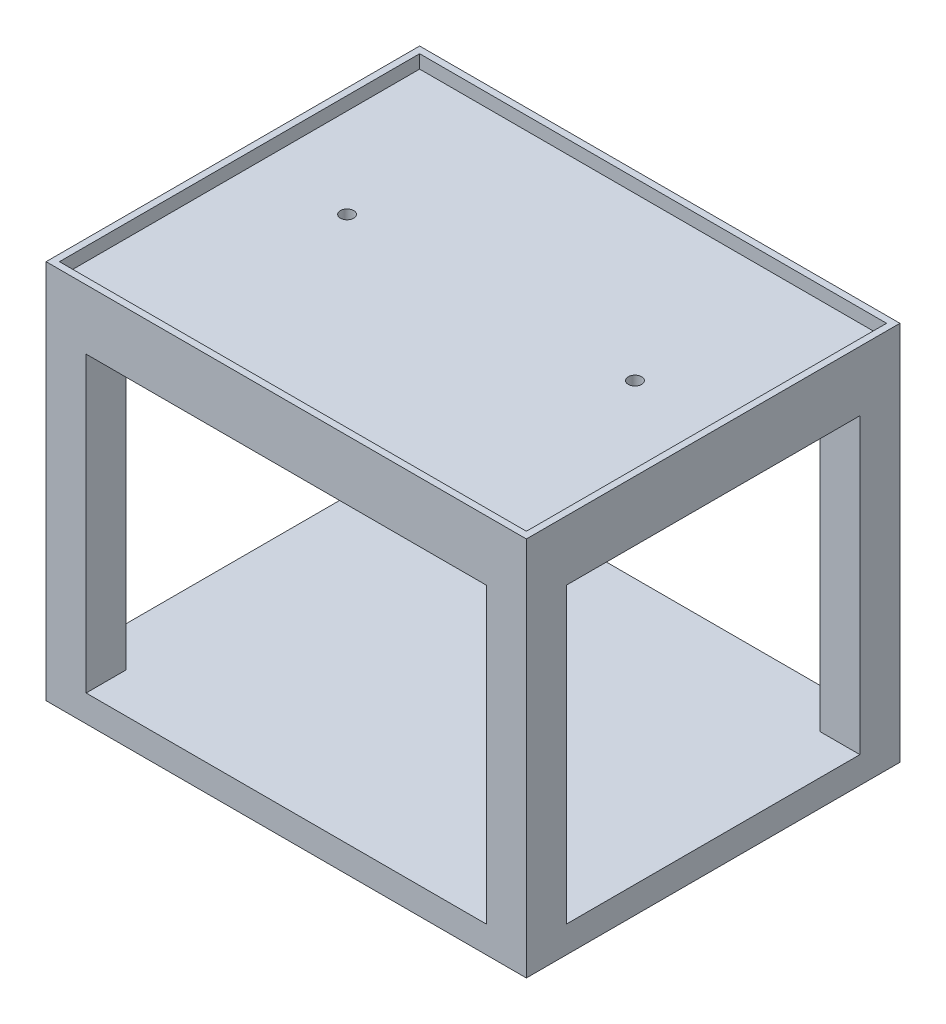
ISO-10303-21;
HEADER;
FILE_DESCRIPTION(('STEP AP214'),'2;1');
FILE_NAME('part.step','',(''),(''),'','','');
FILE_SCHEMA(('AUTOMOTIVE_DESIGN { 1 0 10303 214 1 1 1 1 }'));
ENDSEC;
DATA;
#1=APPLICATION_CONTEXT('core data for automotive mechanical design processes');
#2=APPLICATION_PROTOCOL_DEFINITION('international standard','automotive_design',2000,#1);
#3=PRODUCT_CONTEXT('',#1,'mechanical');
#4=PRODUCT('Part','Part','',(#3));
#5=PRODUCT_RELATED_PRODUCT_CATEGORY('part','',(#4));
#6=PRODUCT_DEFINITION_FORMATION('','',#4);
#7=PRODUCT_DEFINITION_CONTEXT('part definition',#1,'design');
#8=PRODUCT_DEFINITION('design','',#6,#7);
#9=PRODUCT_DEFINITION_SHAPE('','',#8);
#10=(LENGTH_UNIT() NAMED_UNIT(*) SI_UNIT(.MILLI.,.METRE.));
#11=(NAMED_UNIT(*) PLANE_ANGLE_UNIT() SI_UNIT($,.RADIAN.));
#12=(NAMED_UNIT(*) SI_UNIT($,.STERADIAN.) SOLID_ANGLE_UNIT());
#13=UNCERTAINTY_MEASURE_WITH_UNIT(LENGTH_MEASURE(1.E-05),#10,'distance_accuracy_value','');
#14=(GEOMETRIC_REPRESENTATION_CONTEXT(3) GLOBAL_UNCERTAINTY_ASSIGNED_CONTEXT((#13)) GLOBAL_UNIT_ASSIGNED_CONTEXT((#10,
#11,#12)) REPRESENTATION_CONTEXT('',''));
#15=CARTESIAN_POINT('',(0.,0.,0.));
#16=DIRECTION('',(0.,0.,1.));
#17=DIRECTION('',(1.,0.,0.));
#18=AXIS2_PLACEMENT_3D('',#15,#16,#17);
#19=CARTESIAN_POINT('',(-457.2,-609.6,279.4));
#20=DIRECTION('',(0.,0.,1.));
#21=DIRECTION('',(1.,0.,0.));
#22=AXIS2_PLACEMENT_3D('',#19,#20,#21);
#23=PLANE('',#22);
#24=DIRECTION('',(1.,0.,0.));
#25=VECTOR('',#24,1.);
#26=CARTESIAN_POINT('',(-457.2,-558.8,279.4));
#27=LINE('',#26,#25);
#28=CARTESIAN_POINT('',(-457.2,-558.8,279.4));
#29=VERTEX_POINT('',#28);
#30=CARTESIAN_POINT('',(-381.,-558.8,279.4));
#31=VERTEX_POINT('',#30);
#32=EDGE_CURVE('E615',#29,#31,#27,.T.);
#33=ORIENTED_EDGE('',*,*,#32,.F.);
#34=DIRECTION('',(0.,1.,0.));
#35=VECTOR('',#34,1.);
#36=CARTESIAN_POINT('',(-457.2,-609.6,279.4));
#37=LINE('',#36,#35);
#38=CARTESIAN_POINT('',(-457.2,0.,279.4));
#39=VERTEX_POINT('',#38);
#40=EDGE_CURVE('E272',#29,#39,#37,.T.);
#41=ORIENTED_EDGE('',*,*,#40,.T.);
#42=DIRECTION('',(1.,0.,0.));
#43=VECTOR('',#42,1.);
#44=CARTESIAN_POINT('',(-457.2,0.,279.4));
#45=LINE('',#44,#43);
#46=CARTESIAN_POINT('',(-381.,0.,279.4));
#47=VERTEX_POINT('',#46);
#48=EDGE_CURVE('E250',#39,#47,#45,.T.);
#49=ORIENTED_EDGE('',*,*,#48,.T.);
#50=DIRECTION('',(0.,1.,0.));
#51=VECTOR('',#50,1.);
#52=CARTESIAN_POINT('',(-381.,-609.6,279.4));
#53=LINE('',#52,#51);
#54=EDGE_CURVE('E269',#31,#47,#53,.T.);
#55=ORIENTED_EDGE('',*,*,#54,.F.);
#56=EDGE_LOOP('',(#33,#41,#49,#55));
#57=FACE_BOUND('',#56,.T.);
#58=ADVANCED_FACE('F40',(#57),#23,.F.);
#59=CARTESIAN_POINT('',(-381.,-609.6,355.6));
#60=DIRECTION('',(-1.,0.,0.));
#61=DIRECTION('',(0.,0.,1.));
#62=AXIS2_PLACEMENT_3D('',#59,#60,#61);
#63=PLANE('',#62);
#64=DIRECTION('',(0.,0.,1.));
#65=VECTOR('',#64,1.);
#66=CARTESIAN_POINT('',(-381.,-558.8,355.6));
#67=LINE('',#66,#65);
#68=CARTESIAN_POINT('',(-381.,-558.8,355.6));
#69=VERTEX_POINT('',#68);
#70=EDGE_CURVE('E603',#31,#69,#67,.T.);
#71=ORIENTED_EDGE('',*,*,#70,.F.);
#72=ORIENTED_EDGE('',*,*,#54,.T.);
#73=DIRECTION('',(0.,0.,1.));
#74=VECTOR('',#73,1.);
#75=CARTESIAN_POINT('',(-381.,0.,355.6));
#76=LINE('',#75,#74);
#77=CARTESIAN_POINT('',(-381.,0.,355.6));
#78=VERTEX_POINT('',#77);
#79=EDGE_CURVE('E256',#47,#78,#76,.T.);
#80=ORIENTED_EDGE('',*,*,#79,.T.);
#81=DIRECTION('',(0.,1.,0.));
#82=VECTOR('',#81,1.);
#83=CARTESIAN_POINT('',(-381.,-609.6,355.6));
#84=LINE('',#83,#82);
#85=EDGE_CURVE('E260',#69,#78,#84,.T.);
#86=ORIENTED_EDGE('',*,*,#85,.F.);
#87=EDGE_LOOP('',(#71,#72,#80,#86));
#88=FACE_BOUND('',#87,.T.);
#89=ADVANCED_FACE('F385',(#88),#63,.F.);
#90=CARTESIAN_POINT('',(381.,-609.6,355.6));
#91=DIRECTION('',(1.,0.,0.));
#92=DIRECTION('',(0.,0.,-1.));
#93=AXIS2_PLACEMENT_3D('',#90,#91,#92);
#94=PLANE('',#93);
#95=DIRECTION('',(0.,0.,-1.));
#96=VECTOR('',#95,1.);
#97=CARTESIAN_POINT('',(381.,-558.8,355.6));
#98=LINE('',#97,#96);
#99=CARTESIAN_POINT('',(381.,-558.8,355.6));
#100=VERTEX_POINT('',#99);
#101=CARTESIAN_POINT('',(381.,-558.8,279.4));
#102=VERTEX_POINT('',#101);
#103=EDGE_CURVE('E598',#100,#102,#98,.T.);
#104=ORIENTED_EDGE('',*,*,#103,.F.);
#105=DIRECTION('',(0.,1.,0.));
#106=VECTOR('',#105,1.);
#107=CARTESIAN_POINT('',(381.,-609.6,355.6));
#108=LINE('',#107,#106);
#109=CARTESIAN_POINT('',(381.,0.,355.6));
#110=VERTEX_POINT('',#109);
#111=EDGE_CURVE('E247',#100,#110,#108,.T.);
#112=ORIENTED_EDGE('',*,*,#111,.T.);
#113=DIRECTION('',(0.,0.,-1.));
#114=VECTOR('',#113,1.);
#115=CARTESIAN_POINT('',(381.,0.,355.6));
#116=LINE('',#115,#114);
#117=CARTESIAN_POINT('',(381.,0.,279.4));
#118=VERTEX_POINT('',#117);
#119=EDGE_CURVE('E231',#110,#118,#116,.T.);
#120=ORIENTED_EDGE('',*,*,#119,.T.);
#121=DIRECTION('',(0.,1.,0.));
#122=VECTOR('',#121,1.);
#123=CARTESIAN_POINT('',(381.,-609.6,279.4));
#124=LINE('',#123,#122);
#125=EDGE_CURVE('E244',#102,#118,#124,.T.);
#126=ORIENTED_EDGE('',*,*,#125,.F.);
#127=EDGE_LOOP('',(#104,#112,#120,#126));
#128=FACE_BOUND('',#127,.T.);
#129=ADVANCED_FACE('F391',(#128),#94,.F.);
#130=CARTESIAN_POINT('',(457.2,-609.6,279.4));
#131=DIRECTION('',(0.,0.,1.));
#132=DIRECTION('',(1.,0.,0.));
#133=AXIS2_PLACEMENT_3D('',#130,#131,#132);
#134=PLANE('',#133);
#135=DIRECTION('',(1.,0.,0.));
#136=VECTOR('',#135,1.);
#137=CARTESIAN_POINT('',(457.2,-558.8,279.4));
#138=LINE('',#137,#136);
#139=CARTESIAN_POINT('',(457.2,-558.8,279.4));
#140=VERTEX_POINT('',#139);
#141=EDGE_CURVE('E604',#102,#140,#138,.T.);
#142=ORIENTED_EDGE('',*,*,#141,.F.);
#143=ORIENTED_EDGE('',*,*,#125,.T.);
#144=DIRECTION('',(1.,0.,0.));
#145=VECTOR('',#144,1.);
#146=CARTESIAN_POINT('',(457.2,0.,279.4));
#147=LINE('',#146,#145);
#148=CARTESIAN_POINT('',(457.2,0.,279.4));
#149=VERTEX_POINT('',#148);
#150=EDGE_CURVE('E236',#118,#149,#147,.T.);
#151=ORIENTED_EDGE('',*,*,#150,.T.);
#152=DIRECTION('',(0.,1.,0.));
#153=VECTOR('',#152,1.);
#154=CARTESIAN_POINT('',(457.2,-609.6,279.4));
#155=LINE('',#154,#153);
#156=EDGE_CURVE('E64',#140,#149,#155,.T.);
#157=ORIENTED_EDGE('',*,*,#156,.F.);
#158=EDGE_LOOP('',(#142,#143,#151,#157));
#159=FACE_BOUND('',#158,.T.);
#160=ADVANCED_FACE('F556',(#159),#134,.F.);
#161=CARTESIAN_POINT('',(457.2,-609.6,-279.4));
#162=DIRECTION('',(0.,0.,-1.));
#163=DIRECTION('',(-1.,0.,0.));
#164=AXIS2_PLACEMENT_3D('',#161,#162,#163);
#165=PLANE('',#164);
#166=DIRECTION('',(-1.,0.,0.));
#167=VECTOR('',#166,1.);
#168=CARTESIAN_POINT('',(457.2,-558.8,-279.4));
#169=LINE('',#168,#167);
#170=CARTESIAN_POINT('',(457.2,-558.8,-279.4));
#171=VERTEX_POINT('',#170);
#172=CARTESIAN_POINT('',(381.,-558.8,-279.4));
#173=VERTEX_POINT('',#172);
#174=EDGE_CURVE('E636',#171,#173,#169,.T.);
#175=ORIENTED_EDGE('',*,*,#174,.F.);
#176=DIRECTION('',(0.,1.,0.));
#177=VECTOR('',#176,1.);
#178=CARTESIAN_POINT('',(457.2,-609.6,-279.4));
#179=LINE('',#178,#177);
#180=CARTESIAN_POINT('',(457.2,0.,-279.4));
#181=VERTEX_POINT('',#180);
#182=EDGE_CURVE('E228',#171,#181,#179,.T.);
#183=ORIENTED_EDGE('',*,*,#182,.T.);
#184=DIRECTION('',(-1.,0.,0.));
#185=VECTOR('',#184,1.);
#186=CARTESIAN_POINT('',(457.2,0.,-279.4));
#187=LINE('',#186,#185);
#188=CARTESIAN_POINT('',(381.,0.,-279.4));
#189=VERTEX_POINT('',#188);
#190=EDGE_CURVE('E206',#181,#189,#187,.T.);
#191=ORIENTED_EDGE('',*,*,#190,.T.);
#192=DIRECTION('',(0.,1.,0.));
#193=VECTOR('',#192,1.);
#194=CARTESIAN_POINT('',(381.,-609.6,-279.4));
#195=LINE('',#194,#193);
#196=EDGE_CURVE('E225',#173,#189,#195,.T.);
#197=ORIENTED_EDGE('',*,*,#196,.F.);
#198=EDGE_LOOP('',(#175,#183,#191,#197));
#199=FACE_BOUND('',#198,.T.);
#200=ADVANCED_FACE('F546',(#199),#165,.F.);
#201=CARTESIAN_POINT('',(381.,-609.6,-355.6));
#202=DIRECTION('',(1.,0.,0.));
#203=DIRECTION('',(0.,0.,-1.));
#204=AXIS2_PLACEMENT_3D('',#201,#202,#203);
#205=PLANE('',#204);
#206=DIRECTION('',(0.,0.,-1.));
#207=VECTOR('',#206,1.);
#208=CARTESIAN_POINT('',(381.,-558.8,-355.6));
#209=LINE('',#208,#207);
#210=CARTESIAN_POINT('',(381.,-558.8,-355.6));
#211=VERTEX_POINT('',#210);
#212=EDGE_CURVE('E185',#173,#211,#209,.T.);
#213=ORIENTED_EDGE('',*,*,#212,.F.);
#214=ORIENTED_EDGE('',*,*,#196,.T.);
#215=DIRECTION('',(0.,0.,-1.));
#216=VECTOR('',#215,1.);
#217=CARTESIAN_POINT('',(381.,0.,-355.6));
#218=LINE('',#217,#216);
#219=CARTESIAN_POINT('',(381.,0.,-355.6));
#220=VERTEX_POINT('',#219);
#221=EDGE_CURVE('E211',#189,#220,#218,.T.);
#222=ORIENTED_EDGE('',*,*,#221,.T.);
#223=DIRECTION('',(0.,1.,0.));
#224=VECTOR('',#223,1.);
#225=CARTESIAN_POINT('',(381.,-609.6,-355.6));
#226=LINE('',#225,#224);
#227=EDGE_CURVE('E56',#211,#220,#226,.T.);
#228=ORIENTED_EDGE('',*,*,#227,.F.);
#229=EDGE_LOOP('',(#213,#214,#222,#228));
#230=FACE_BOUND('',#229,.T.);
#231=ADVANCED_FACE('F537',(#230),#205,.F.);
#232=CARTESIAN_POINT('',(-381.,-609.6,-355.6));
#233=DIRECTION('',(-1.,0.,0.));
#234=DIRECTION('',(0.,0.,1.));
#235=AXIS2_PLACEMENT_3D('',#232,#233,#234);
#236=PLANE('',#235);
#237=DIRECTION('',(0.,0.,1.));
#238=VECTOR('',#237,1.);
#239=CARTESIAN_POINT('',(-381.,-558.8,-355.6));
#240=LINE('',#239,#238);
#241=CARTESIAN_POINT('',(-381.,-558.8,-355.6));
#242=VERTEX_POINT('',#241);
#243=CARTESIAN_POINT('',(-381.,-558.8,-279.4));
#244=VERTEX_POINT('',#243);
#245=EDGE_CURVE('E182',#242,#244,#240,.T.);
#246=ORIENTED_EDGE('',*,*,#245,.F.);
#247=DIRECTION('',(0.,1.,0.));
#248=VECTOR('',#247,1.);
#249=CARTESIAN_POINT('',(-381.,-609.6,-355.6));
#250=LINE('',#249,#248);
#251=CARTESIAN_POINT('',(-381.,0.,-355.6));
#252=VERTEX_POINT('',#251);
#253=EDGE_CURVE('E195',#242,#252,#250,.T.);
#254=ORIENTED_EDGE('',*,*,#253,.T.);
#255=DIRECTION('',(0.,0.,1.));
#256=VECTOR('',#255,1.);
#257=CARTESIAN_POINT('',(-381.,0.,-355.6));
#258=LINE('',#257,#256);
#259=CARTESIAN_POINT('',(-381.,0.,-279.4));
#260=VERTEX_POINT('',#259);
#261=EDGE_CURVE('E625',#252,#260,#258,.T.);
#262=ORIENTED_EDGE('',*,*,#261,.T.);
#263=DIRECTION('',(0.,1.,0.));
#264=VECTOR('',#263,1.);
#265=CARTESIAN_POINT('',(-381.,-609.6,-279.4));
#266=LINE('',#265,#264);
#267=EDGE_CURVE('E197',#244,#260,#266,.T.);
#268=ORIENTED_EDGE('',*,*,#267,.F.);
#269=EDGE_LOOP('',(#246,#254,#262,#268));
#270=FACE_BOUND('',#269,.T.);
#271=ADVANCED_FACE('F193',(#270),#236,.F.);
#272=CARTESIAN_POINT('',(-457.2,-609.6,-279.4));
#273=DIRECTION('',(0.,0.,-1.));
#274=DIRECTION('',(-1.,0.,0.));
#275=AXIS2_PLACEMENT_3D('',#272,#273,#274);
#276=PLANE('',#275);
#277=DIRECTION('',(-1.,0.,0.));
#278=VECTOR('',#277,1.);
#279=CARTESIAN_POINT('',(-457.2,-558.8,-279.4));
#280=LINE('',#279,#278);
#281=CARTESIAN_POINT('',(-457.2,-558.8,-279.4));
#282=VERTEX_POINT('',#281);
#283=EDGE_CURVE('E12',#244,#282,#280,.T.);
#284=ORIENTED_EDGE('',*,*,#283,.F.);
#285=ORIENTED_EDGE('',*,*,#267,.T.);
#286=DIRECTION('',(-1.,0.,0.));
#287=VECTOR('',#286,1.);
#288=CARTESIAN_POINT('',(-457.2,0.,-279.4));
#289=LINE('',#288,#287);
#290=CARTESIAN_POINT('',(-457.2,0.,-279.4));
#291=VERTEX_POINT('',#290);
#292=EDGE_CURVE('E620',#260,#291,#289,.T.);
#293=ORIENTED_EDGE('',*,*,#292,.T.);
#294=DIRECTION('',(0.,1.,0.));
#295=VECTOR('',#294,1.);
#296=CARTESIAN_POINT('',(-457.2,-609.6,-279.4));
#297=LINE('',#296,#295);
#298=EDGE_CURVE('E213',#282,#291,#297,.T.);
#299=ORIENTED_EDGE('',*,*,#298,.F.);
#300=EDGE_LOOP('',(#284,#285,#293,#299));
#301=FACE_BOUND('',#300,.T.);
#302=ADVANCED_FACE('F523',(#301),#276,.F.);
#303=CARTESIAN_POINT('',(0.,0.,0.));
#304=DIRECTION('',(0.,1.,0.));
#305=DIRECTION('',(0.,0.,1.));
#306=AXIS2_PLACEMENT_3D('',#303,#304,#305);
#307=PLANE('',#306);
#308=CARTESIAN_POINT('',(-274.028125044,0.,-34.29999998));
#309=DIRECTION('',(0.,1.,0.));
#310=DIRECTION('',(0.,0.,1.));
#311=AXIS2_PLACEMENT_3D('',#308,#309,#310);
#312=CIRCLE('',#311,12.7);
#313=CARTESIAN_POINT('',(-274.028125044,0.,-21.5999999800001));
#314=VERTEX_POINT('',#313);
#315=EDGE_CURVE('E655',#314,#314,#312,.T.);
#316=ORIENTED_EDGE('',*,*,#315,.T.);
#317=EDGE_LOOP('',(#316));
#318=FACE_BOUND('',#317,.T.);
#319=CARTESIAN_POINT('',(274.028125044,0.,-34.29999998));
#320=DIRECTION('',(0.,1.,0.));
#321=DIRECTION('',(0.,0.,1.));
#322=AXIS2_PLACEMENT_3D('',#319,#320,#321);
#323=CIRCLE('',#322,12.7);
#324=CARTESIAN_POINT('',(274.028125044,0.,-21.5999999800001));
#325=VERTEX_POINT('',#324);
#326=EDGE_CURVE('E647',#325,#325,#323,.T.);
#327=ORIENTED_EDGE('',*,*,#326,.T.);
#328=EDGE_LOOP('',(#327));
#329=FACE_BOUND('',#328,.T.);
#330=ORIENTED_EDGE('',*,*,#261,.F.);
#331=DIRECTION('',(-1.,0.,0.));
#332=VECTOR('',#331,1.);
#333=CARTESIAN_POINT('',(457.2,0.,-355.6));
#334=LINE('',#333,#332);
#335=EDGE_CURVE('E204',#220,#252,#334,.T.);
#336=ORIENTED_EDGE('',*,*,#335,.F.);
#337=ORIENTED_EDGE('',*,*,#221,.F.);
#338=ORIENTED_EDGE('',*,*,#190,.F.);
#339=DIRECTION('',(0.,0.,-1.));
#340=VECTOR('',#339,1.);
#341=CARTESIAN_POINT('',(457.2,0.,355.6));
#342=LINE('',#341,#340);
#343=EDGE_CURVE('E337',#149,#181,#342,.T.);
#344=ORIENTED_EDGE('',*,*,#343,.F.);
#345=ORIENTED_EDGE('',*,*,#150,.F.);
#346=ORIENTED_EDGE('',*,*,#119,.F.);
#347=DIRECTION('',(1.,0.,0.));
#348=VECTOR('',#347,1.);
#349=CARTESIAN_POINT('',(457.2,0.,355.6));
#350=LINE('',#349,#348);
#351=EDGE_CURVE('E333',#78,#110,#350,.T.);
#352=ORIENTED_EDGE('',*,*,#351,.F.);
#353=ORIENTED_EDGE('',*,*,#79,.F.);
#354=ORIENTED_EDGE('',*,*,#48,.F.);
#355=DIRECTION('',(0.,0.,1.));
#356=VECTOR('',#355,1.);
#357=CARTESIAN_POINT('',(-457.2,0.,355.6));
#358=LINE('',#357,#356);
#359=EDGE_CURVE('E315',#291,#39,#358,.T.);
#360=ORIENTED_EDGE('',*,*,#359,.F.);
#361=ORIENTED_EDGE('',*,*,#292,.F.);
#362=EDGE_LOOP('',(#330,#336,#337,#338,#344,#345,#346,#352,#353,#354,#360,#361));
#363=FACE_BOUND('',#362,.T.);
#364=ADVANCED_FACE('F514',(#318,#329,#363),#307,.F.);
#365=CARTESIAN_POINT('',(-457.2,114.3,355.6));
#366=DIRECTION('',(1.,0.,0.));
#367=DIRECTION('',(0.,0.,-1.));
#368=AXIS2_PLACEMENT_3D('',#365,#366,#367);
#369=PLANE('',#368);
#370=ORIENTED_EDGE('',*,*,#40,.F.);
#371=DIRECTION('',(0.,0.,-1.));
#372=VECTOR('',#371,1.);
#373=CARTESIAN_POINT('',(-457.2,-558.8,355.6));
#374=LINE('',#373,#372);
#375=EDGE_CURVE('E189',#29,#282,#374,.T.);
#376=ORIENTED_EDGE('',*,*,#375,.T.);
#377=ORIENTED_EDGE('',*,*,#298,.T.);
#378=ORIENTED_EDGE('',*,*,#359,.T.);
#379=EDGE_LOOP('',(#370,#376,#377,#378));
#380=FACE_BOUND('',#379,.T.);
#381=DIRECTION('',(0.,-1.,0.));
#382=VECTOR('',#381,1.);
#383=CARTESIAN_POINT('',(-457.2,114.3,-355.6));
#384=LINE('',#383,#382);
#385=CARTESIAN_POINT('',(-457.2,114.3,-355.6));
#386=VERTEX_POINT('',#385);
#387=CARTESIAN_POINT('',(-457.2,-609.6,-355.6));
#388=VERTEX_POINT('',#387);
#389=EDGE_CURVE('E329',#386,#388,#384,.T.);
#390=ORIENTED_EDGE('',*,*,#389,.T.);
#391=DIRECTION('',(0.,0.,-1.));
#392=VECTOR('',#391,1.);
#393=CARTESIAN_POINT('',(-457.2,-609.6,355.6));
#394=LINE('',#393,#392);
#395=CARTESIAN_POINT('',(-457.2,-609.6,355.6));
#396=VERTEX_POINT('',#395);
#397=EDGE_CURVE('E251',#396,#388,#394,.T.);
#398=ORIENTED_EDGE('',*,*,#397,.F.);
#399=DIRECTION('',(0.,-1.,0.));
#400=VECTOR('',#399,1.);
#401=CARTESIAN_POINT('',(-457.2,114.3,355.6));
#402=LINE('',#401,#400);
#403=CARTESIAN_POINT('',(-457.2,114.3,355.6));
#404=VERTEX_POINT('',#403);
#405=EDGE_CURVE('E49',#404,#396,#402,.T.);
#406=ORIENTED_EDGE('',*,*,#405,.F.);
#407=DIRECTION('',(0.,0.,1.));
#408=VECTOR('',#407,1.);
#409=CARTESIAN_POINT('',(-457.2,114.3,355.6));
#410=LINE('',#409,#408);
#411=EDGE_CURVE('E316',#386,#404,#410,.T.);
#412=ORIENTED_EDGE('',*,*,#411,.F.);
#413=EDGE_LOOP('',(#390,#398,#406,#412));
#414=FACE_BOUND('',#413,.T.);
#415=ADVANCED_FACE('F42',(#380,#414),#369,.F.);
#416=CARTESIAN_POINT('',(457.2,114.3,355.6));
#417=DIRECTION('',(0.,0.,-1.));
#418=DIRECTION('',(-1.,0.,0.));
#419=AXIS2_PLACEMENT_3D('',#416,#417,#418);
#420=PLANE('',#419);
#421=ORIENTED_EDGE('',*,*,#111,.F.);
#422=DIRECTION('',(-1.,0.,0.));
#423=VECTOR('',#422,1.);
#424=CARTESIAN_POINT('',(-457.2,-558.8,355.6));
#425=LINE('',#424,#423);
#426=EDGE_CURVE('E199',#100,#69,#425,.T.);
#427=ORIENTED_EDGE('',*,*,#426,.T.);
#428=ORIENTED_EDGE('',*,*,#85,.T.);
#429=ORIENTED_EDGE('',*,*,#351,.T.);
#430=EDGE_LOOP('',(#421,#427,#428,#429));
#431=FACE_BOUND('',#430,.T.);
#432=DIRECTION('',(-1.,0.,0.));
#433=VECTOR('',#432,1.);
#434=CARTESIAN_POINT('',(-457.2,-609.6,355.6));
#435=LINE('',#434,#433);
#436=CARTESIAN_POINT('',(457.2,-609.6,355.6));
#437=VERTEX_POINT('',#436);
#438=EDGE_CURVE('E255',#437,#396,#435,.T.);
#439=ORIENTED_EDGE('',*,*,#438,.F.);
#440=DIRECTION('',(0.,-1.,0.));
#441=VECTOR('',#440,1.);
#442=CARTESIAN_POINT('',(457.2,114.3,355.6));
#443=LINE('',#442,#441);
#444=CARTESIAN_POINT('',(457.2,114.3,355.6));
#445=VERTEX_POINT('',#444);
#446=EDGE_CURVE('E347',#445,#437,#443,.T.);
#447=ORIENTED_EDGE('',*,*,#446,.F.);
#448=DIRECTION('',(1.,0.,0.));
#449=VECTOR('',#448,1.);
#450=CARTESIAN_POINT('',(457.2,114.3,355.6));
#451=LINE('',#450,#449);
#452=EDGE_CURVE('E320',#404,#445,#451,.T.);
#453=ORIENTED_EDGE('',*,*,#452,.F.);
#454=ORIENTED_EDGE('',*,*,#405,.T.);
#455=EDGE_LOOP('',(#439,#447,#453,#454));
#456=FACE_BOUND('',#455,.T.);
#457=ADVANCED_FACE('F353',(#431,#456),#420,.F.);
#458=CARTESIAN_POINT('',(457.2,114.3,355.6));
#459=DIRECTION('',(-1.,0.,0.));
#460=DIRECTION('',(0.,0.,1.));
#461=AXIS2_PLACEMENT_3D('',#458,#459,#460);
#462=PLANE('',#461);
#463=ORIENTED_EDGE('',*,*,#182,.F.);
#464=DIRECTION('',(0.,0.,1.));
#465=VECTOR('',#464,1.);
#466=CARTESIAN_POINT('',(457.2,-558.8,355.6));
#467=LINE('',#466,#465);
#468=EDGE_CURVE('E188',#171,#140,#467,.T.);
#469=ORIENTED_EDGE('',*,*,#468,.T.);
#470=ORIENTED_EDGE('',*,*,#156,.T.);
#471=ORIENTED_EDGE('',*,*,#343,.T.);
#472=EDGE_LOOP('',(#463,#469,#470,#471));
#473=FACE_BOUND('',#472,.T.);
#474=DIRECTION('',(0.,0.,1.));
#475=VECTOR('',#474,1.);
#476=CARTESIAN_POINT('',(457.2,-609.6,355.6));
#477=LINE('',#476,#475);
#478=CARTESIAN_POINT('',(457.2,-609.6,-355.6));
#479=VERTEX_POINT('',#478);
#480=EDGE_CURVE('E232',#479,#437,#477,.T.);
#481=ORIENTED_EDGE('',*,*,#480,.F.);
#482=DIRECTION('',(0.,-1.,0.));
#483=VECTOR('',#482,1.);
#484=CARTESIAN_POINT('',(457.2,114.3,-355.6));
#485=LINE('',#484,#483);
#486=CARTESIAN_POINT('',(457.2,114.3,-355.6));
#487=VERTEX_POINT('',#486);
#488=EDGE_CURVE('E344',#487,#479,#485,.T.);
#489=ORIENTED_EDGE('',*,*,#488,.F.);
#490=DIRECTION('',(0.,0.,-1.));
#491=VECTOR('',#490,1.);
#492=CARTESIAN_POINT('',(457.2,114.3,355.6));
#493=LINE('',#492,#491);
#494=EDGE_CURVE('E323',#445,#487,#493,.T.);
#495=ORIENTED_EDGE('',*,*,#494,.F.);
#496=ORIENTED_EDGE('',*,*,#446,.T.);
#497=EDGE_LOOP('',(#481,#489,#495,#496));
#498=FACE_BOUND('',#497,.T.);
#499=ADVANCED_FACE('F367',(#473,#498),#462,.F.);
#500=CARTESIAN_POINT('',(457.2,114.3,-355.6));
#501=DIRECTION('',(0.,0.,1.));
#502=DIRECTION('',(1.,0.,0.));
#503=AXIS2_PLACEMENT_3D('',#500,#501,#502);
#504=PLANE('',#503);
#505=ORIENTED_EDGE('',*,*,#253,.F.);
#506=DIRECTION('',(1.,0.,0.));
#507=VECTOR('',#506,1.);
#508=CARTESIAN_POINT('',(-457.2,-558.8,-355.6));
#509=LINE('',#508,#507);
#510=EDGE_CURVE('E179',#242,#211,#509,.T.);
#511=ORIENTED_EDGE('',*,*,#510,.T.);
#512=ORIENTED_EDGE('',*,*,#227,.T.);
#513=ORIENTED_EDGE('',*,*,#335,.T.);
#514=EDGE_LOOP('',(#505,#511,#512,#513));
#515=FACE_BOUND('',#514,.T.);
#516=DIRECTION('',(1.,0.,0.));
#517=VECTOR('',#516,1.);
#518=CARTESIAN_POINT('',(457.2,-609.6,-355.6));
#519=LINE('',#518,#517);
#520=EDGE_CURVE('E217',#388,#479,#519,.T.);
#521=ORIENTED_EDGE('',*,*,#520,.F.);
#522=ORIENTED_EDGE('',*,*,#389,.F.);
#523=DIRECTION('',(-1.,0.,0.));
#524=VECTOR('',#523,1.);
#525=CARTESIAN_POINT('',(457.2,114.3,-355.6));
#526=LINE('',#525,#524);
#527=EDGE_CURVE('E326',#487,#386,#526,.T.);
#528=ORIENTED_EDGE('',*,*,#527,.F.);
#529=ORIENTED_EDGE('',*,*,#488,.T.);
#530=EDGE_LOOP('',(#521,#522,#528,#529));
#531=FACE_BOUND('',#530,.T.);
#532=ADVANCED_FACE('F201',(#515,#531),#504,.F.);
#533=CARTESIAN_POINT('',(0.,114.3,0.));
#534=DIRECTION('',(0.,1.,0.));
#535=DIRECTION('',(0.,0.,1.));
#536=AXIS2_PLACEMENT_3D('',#533,#534,#535);
#537=PLANE('',#536);
#538=DIRECTION('',(-1.,0.,0.));
#539=VECTOR('',#538,1.);
#540=CARTESIAN_POINT('',(444.5,114.3,-342.9));
#541=LINE('',#540,#539);
#542=CARTESIAN_POINT('',(444.5,114.3,-342.9));
#543=VERTEX_POINT('',#542);
#544=CARTESIAN_POINT('',(-444.5,114.3,-342.9));
#545=VERTEX_POINT('',#544);
#546=EDGE_CURVE('E275',#543,#545,#541,.T.);
#547=ORIENTED_EDGE('',*,*,#546,.F.);
#548=DIRECTION('',(0.,0.,-1.));
#549=VECTOR('',#548,1.);
#550=CARTESIAN_POINT('',(444.5,114.3,342.9));
#551=LINE('',#550,#549);
#552=CARTESIAN_POINT('',(444.5,114.3,342.9));
#553=VERTEX_POINT('',#552);
#554=EDGE_CURVE('E297',#553,#543,#551,.T.);
#555=ORIENTED_EDGE('',*,*,#554,.F.);
#556=DIRECTION('',(1.,0.,0.));
#557=VECTOR('',#556,1.);
#558=CARTESIAN_POINT('',(-444.5,114.3,342.9));
#559=LINE('',#558,#557);
#560=CARTESIAN_POINT('',(-444.5,114.3,342.9));
#561=VERTEX_POINT('',#560);
#562=EDGE_CURVE('E293',#561,#553,#559,.T.);
#563=ORIENTED_EDGE('',*,*,#562,.F.);
#564=DIRECTION('',(0.,0.,1.));
#565=VECTOR('',#564,1.);
#566=CARTESIAN_POINT('',(-444.5,114.3,-342.9));
#567=LINE('',#566,#565);
#568=EDGE_CURVE('E289',#545,#561,#567,.T.);
#569=ORIENTED_EDGE('',*,*,#568,.F.);
#570=EDGE_LOOP('',(#547,#555,#563,#569));
#571=FACE_BOUND('',#570,.T.);
#572=ORIENTED_EDGE('',*,*,#411,.T.);
#573=ORIENTED_EDGE('',*,*,#452,.T.);
#574=ORIENTED_EDGE('',*,*,#494,.T.);
#575=ORIENTED_EDGE('',*,*,#527,.T.);
#576=EDGE_LOOP('',(#572,#573,#574,#575));
#577=FACE_BOUND('',#576,.T.);
#578=ADVANCED_FACE('F369',(#571,#577),#537,.T.);
#579=CARTESIAN_POINT('',(444.5,-1122.78343414926,-342.9));
#580=DIRECTION('',(0.,0.,-1.));
#581=DIRECTION('',(-1.,0.,0.));
#582=AXIS2_PLACEMENT_3D('',#579,#580,#581);
#583=PLANE('',#582);
#584=DIRECTION('',(1.,0.,0.));
#585=VECTOR('',#584,1.);
#586=CARTESIAN_POINT('',(444.5,88.9,-342.9));
#587=LINE('',#586,#585);
#588=CARTESIAN_POINT('',(-444.5,88.9,-342.9));
#589=VERTEX_POINT('',#588);
#590=CARTESIAN_POINT('',(444.5,88.9,-342.9));
#591=VERTEX_POINT('',#590);
#592=EDGE_CURVE('E283',#589,#591,#587,.T.);
#593=ORIENTED_EDGE('',*,*,#592,.T.);
#594=DIRECTION('',(0.,1.,0.));
#595=VECTOR('',#594,1.);
#596=CARTESIAN_POINT('',(444.5,-1122.78343414926,-342.9));
#597=LINE('',#596,#595);
#598=EDGE_CURVE('E280',#591,#543,#597,.T.);
#599=ORIENTED_EDGE('',*,*,#598,.T.);
#600=ORIENTED_EDGE('',*,*,#546,.T.);
#601=DIRECTION('',(0.,1.,0.));
#602=VECTOR('',#601,1.);
#603=CARTESIAN_POINT('',(-444.5,-1122.78343414926,-342.9));
#604=LINE('',#603,#602);
#605=EDGE_CURVE('E301',#589,#545,#604,.T.);
#606=ORIENTED_EDGE('',*,*,#605,.F.);
#607=EDGE_LOOP('',(#593,#599,#600,#606));
#608=FACE_BOUND('',#607,.T.);
#609=ADVANCED_FACE('F371',(#608),#583,.F.);
#610=CARTESIAN_POINT('',(444.5,-1122.78343414926,342.9));
#611=DIRECTION('',(1.,0.,0.));
#612=DIRECTION('',(0.,0.,-1.));
#613=AXIS2_PLACEMENT_3D('',#610,#611,#612);
#614=PLANE('',#613);
#615=DIRECTION('',(0.,0.,1.));
#616=VECTOR('',#615,1.);
#617=CARTESIAN_POINT('',(444.5,88.9,342.9));
#618=LINE('',#617,#616);
#619=CARTESIAN_POINT('',(444.5,88.9,342.9));
#620=VERTEX_POINT('',#619);
#621=EDGE_CURVE('E279',#591,#620,#618,.T.);
#622=ORIENTED_EDGE('',*,*,#621,.T.);
#623=DIRECTION('',(0.,1.,0.));
#624=VECTOR('',#623,1.);
#625=CARTESIAN_POINT('',(444.5,-1122.78343414926,342.9));
#626=LINE('',#625,#624);
#627=EDGE_CURVE('E304',#620,#553,#626,.T.);
#628=ORIENTED_EDGE('',*,*,#627,.T.);
#629=ORIENTED_EDGE('',*,*,#554,.T.);
#630=ORIENTED_EDGE('',*,*,#598,.F.);
#631=EDGE_LOOP('',(#622,#628,#629,#630));
#632=FACE_BOUND('',#631,.T.);
#633=ADVANCED_FACE('F378',(#632),#614,.F.);
#634=CARTESIAN_POINT('',(-444.5,-1122.78343414926,342.9));
#635=DIRECTION('',(0.,0.,1.));
#636=DIRECTION('',(1.,0.,0.));
#637=AXIS2_PLACEMENT_3D('',#634,#635,#636);
#638=PLANE('',#637);
#639=DIRECTION('',(-1.,0.,0.));
#640=VECTOR('',#639,1.);
#641=CARTESIAN_POINT('',(-444.5,88.9,342.9));
#642=LINE('',#641,#640);
#643=CARTESIAN_POINT('',(-444.5,88.9,342.9));
#644=VERTEX_POINT('',#643);
#645=EDGE_CURVE('E276',#620,#644,#642,.T.);
#646=ORIENTED_EDGE('',*,*,#645,.T.);
#647=DIRECTION('',(0.,1.,0.));
#648=VECTOR('',#647,1.);
#649=CARTESIAN_POINT('',(-444.5,-1122.78343414926,342.9));
#650=LINE('',#649,#648);
#651=EDGE_CURVE('E307',#644,#561,#650,.T.);
#652=ORIENTED_EDGE('',*,*,#651,.T.);
#653=ORIENTED_EDGE('',*,*,#562,.T.);
#654=ORIENTED_EDGE('',*,*,#627,.F.);
#655=EDGE_LOOP('',(#646,#652,#653,#654));
#656=FACE_BOUND('',#655,.T.);
#657=ADVANCED_FACE('F404',(#656),#638,.F.);
#658=CARTESIAN_POINT('',(-444.5,-1122.78343414926,-342.9));
#659=DIRECTION('',(-1.,0.,0.));
#660=DIRECTION('',(0.,0.,1.));
#661=AXIS2_PLACEMENT_3D('',#658,#659,#660);
#662=PLANE('',#661);
#663=DIRECTION('',(0.,0.,-1.));
#664=VECTOR('',#663,1.);
#665=CARTESIAN_POINT('',(-444.5,88.9,-342.9));
#666=LINE('',#665,#664);
#667=EDGE_CURVE('E286',#644,#589,#666,.T.);
#668=ORIENTED_EDGE('',*,*,#667,.T.);
#669=ORIENTED_EDGE('',*,*,#605,.T.);
#670=ORIENTED_EDGE('',*,*,#568,.T.);
#671=ORIENTED_EDGE('',*,*,#651,.F.);
#672=EDGE_LOOP('',(#668,#669,#670,#671));
#673=FACE_BOUND('',#672,.T.);
#674=ADVANCED_FACE('F400',(#673),#662,.F.);
#675=CARTESIAN_POINT('',(0.,88.9,0.));
#676=DIRECTION('',(0.,1.,0.));
#677=DIRECTION('',(0.,0.,1.));
#678=AXIS2_PLACEMENT_3D('',#675,#676,#677);
#679=PLANE('',#678);
#680=CARTESIAN_POINT('',(-274.028125044,88.9,-34.29999998));
#681=DIRECTION('',(0.,1.,0.));
#682=DIRECTION('',(0.,0.,1.));
#683=AXIS2_PLACEMENT_3D('',#680,#681,#682);
#684=CIRCLE('',#683,12.7);
#685=CARTESIAN_POINT('',(-274.028125044,88.9,-21.59999998));
#686=VERTEX_POINT('',#685);
#687=EDGE_CURVE('E659',#686,#686,#684,.T.);
#688=ORIENTED_EDGE('',*,*,#687,.F.);
#689=EDGE_LOOP('',(#688));
#690=FACE_BOUND('',#689,.T.);
#691=CARTESIAN_POINT('',(274.028125044,88.9,-34.29999998));
#692=DIRECTION('',(0.,1.,0.));
#693=DIRECTION('',(0.,0.,1.));
#694=AXIS2_PLACEMENT_3D('',#691,#692,#693);
#695=CIRCLE('',#694,12.7);
#696=CARTESIAN_POINT('',(274.028125044,88.9,-21.59999998));
#697=VERTEX_POINT('',#696);
#698=EDGE_CURVE('E651',#697,#697,#695,.T.);
#699=ORIENTED_EDGE('',*,*,#698,.F.);
#700=EDGE_LOOP('',(#699));
#701=FACE_BOUND('',#700,.T.);
#702=ORIENTED_EDGE('',*,*,#592,.F.);
#703=ORIENTED_EDGE('',*,*,#667,.F.);
#704=ORIENTED_EDGE('',*,*,#645,.F.);
#705=ORIENTED_EDGE('',*,*,#621,.F.);
#706=EDGE_LOOP('',(#702,#703,#704,#705));
#707=FACE_BOUND('',#706,.T.);
#708=ADVANCED_FACE('F397',(#690,#701,#707),#679,.T.);
#709=CARTESIAN_POINT('',(0.,-609.6,0.));
#710=DIRECTION('',(0.,-1.,0.));
#711=DIRECTION('',(0.,0.,-1.));
#712=AXIS2_PLACEMENT_3D('',#709,#710,#711);
#713=PLANE('',#712);
#714=ORIENTED_EDGE('',*,*,#397,.T.);
#715=ORIENTED_EDGE('',*,*,#520,.T.);
#716=ORIENTED_EDGE('',*,*,#480,.T.);
#717=ORIENTED_EDGE('',*,*,#438,.T.);
#718=EDGE_LOOP('',(#714,#715,#716,#717));
#719=FACE_BOUND('',#718,.T.);
#720=ADVANCED_FACE('F359',(#719),#713,.T.);
#721=CARTESIAN_POINT('',(0.,-558.8,0.));
#722=DIRECTION('',(0.,-1.,0.));
#723=DIRECTION('',(0.,0.,-1.));
#724=AXIS2_PLACEMENT_3D('',#721,#722,#723);
#725=PLANE('',#724);
#726=ORIENTED_EDGE('',*,*,#375,.F.);
#727=ORIENTED_EDGE('',*,*,#32,.T.);
#728=ORIENTED_EDGE('',*,*,#70,.T.);
#729=ORIENTED_EDGE('',*,*,#426,.F.);
#730=ORIENTED_EDGE('',*,*,#103,.T.);
#731=ORIENTED_EDGE('',*,*,#141,.T.);
#732=ORIENTED_EDGE('',*,*,#468,.F.);
#733=ORIENTED_EDGE('',*,*,#174,.T.);
#734=ORIENTED_EDGE('',*,*,#212,.T.);
#735=ORIENTED_EDGE('',*,*,#510,.F.);
#736=ORIENTED_EDGE('',*,*,#245,.T.);
#737=ORIENTED_EDGE('',*,*,#283,.T.);
#738=EDGE_LOOP('',(#726,#727,#728,#729,#730,#731,#732,#733,#734,#735,#736,#737));
#739=FACE_BOUND('',#738,.T.);
#740=ADVANCED_FACE('F181',(#739),#725,.F.);
#741=CARTESIAN_POINT('',(274.028125044,88.9,-34.29999998));
#742=DIRECTION('',(0.,1.,0.));
#743=DIRECTION('',(0.,0.,1.));
#744=AXIS2_PLACEMENT_3D('',#741,#742,#743);
#745=CYLINDRICAL_SURFACE('',#744,12.7);
#746=ORIENTED_EDGE('',*,*,#326,.F.);
#747=EDGE_LOOP('',(#746));
#748=FACE_BOUND('',#747,.T.);
#749=ORIENTED_EDGE('',*,*,#698,.T.);
#750=EDGE_LOOP('',(#749));
#751=FACE_BOUND('',#750,.T.);
#752=ADVANCED_FACE('F448',(#748,#751),#745,.F.);
#753=CARTESIAN_POINT('',(-274.028125044,88.9,-34.29999998));
#754=DIRECTION('',(0.,1.,0.));
#755=DIRECTION('',(0.,0.,1.));
#756=AXIS2_PLACEMENT_3D('',#753,#754,#755);
#757=CYLINDRICAL_SURFACE('',#756,12.7);
#758=ORIENTED_EDGE('',*,*,#315,.F.);
#759=EDGE_LOOP('',(#758));
#760=FACE_BOUND('',#759,.T.);
#761=ORIENTED_EDGE('',*,*,#687,.T.);
#762=EDGE_LOOP('',(#761));
#763=FACE_BOUND('',#762,.T.);
#764=ADVANCED_FACE('F454',(#760,#763),#757,.F.);
#765=CLOSED_SHELL('',(#58,#89,#129,#160,#200,#231,#271,#302,#364,#415,#457,#499,#532,#578,#609,
#633,#657,#674,#708,#720,#740,#752,#764));
#766=MANIFOLD_SOLID_BREP('B2',#765);
#767=ADVANCED_BREP_SHAPE_REPRESENTATION('',(#18,#766),#14);
#768=SHAPE_DEFINITION_REPRESENTATION(#9,#767);
ENDSEC;
END-ISO-10303-21;
